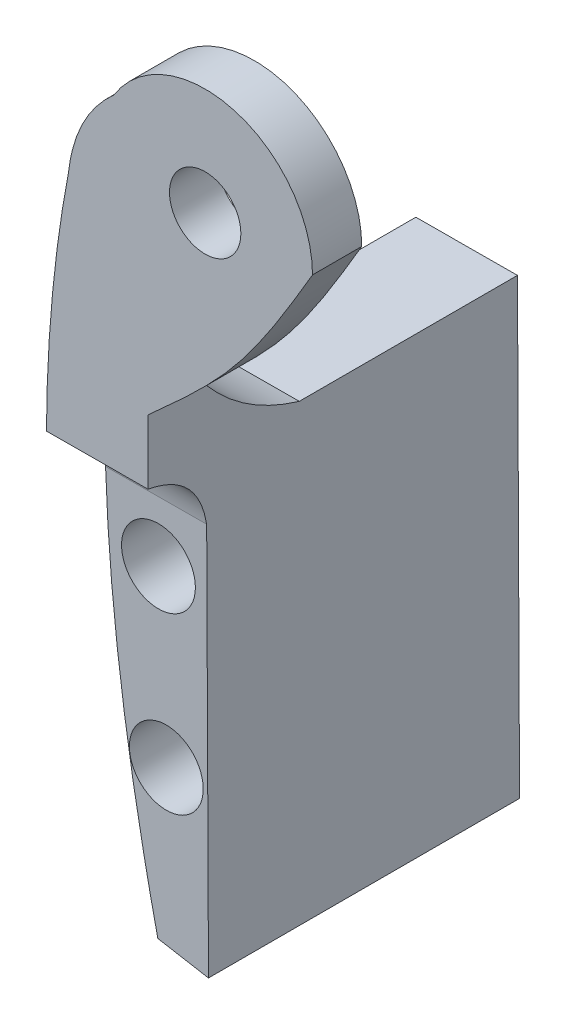
ISO-10303-21;
HEADER;
FILE_DESCRIPTION(('STEP AP214'),'2;1');
FILE_NAME('part.step','',(''),(''),'','','');
FILE_SCHEMA(('AUTOMOTIVE_DESIGN { 1 0 10303 214 1 1 1 1 }'));
ENDSEC;
DATA;
#1=APPLICATION_CONTEXT('core data for automotive mechanical design processes');
#2=APPLICATION_PROTOCOL_DEFINITION('international standard','automotive_design',2000,#1);
#3=PRODUCT_CONTEXT('',#1,'mechanical');
#4=PRODUCT('Part','Part','',(#3));
#5=PRODUCT_RELATED_PRODUCT_CATEGORY('part','',(#4));
#6=PRODUCT_DEFINITION_FORMATION('','',#4);
#7=PRODUCT_DEFINITION_CONTEXT('part definition',#1,'design');
#8=PRODUCT_DEFINITION('design','',#6,#7);
#9=PRODUCT_DEFINITION_SHAPE('','',#8);
#10=(LENGTH_UNIT() NAMED_UNIT(*) SI_UNIT(.MILLI.,.METRE.));
#11=(NAMED_UNIT(*) PLANE_ANGLE_UNIT() SI_UNIT($,.RADIAN.));
#12=(NAMED_UNIT(*) SI_UNIT($,.STERADIAN.) SOLID_ANGLE_UNIT());
#13=UNCERTAINTY_MEASURE_WITH_UNIT(LENGTH_MEASURE(1.E-05),#10,'distance_accuracy_value','');
#14=(GEOMETRIC_REPRESENTATION_CONTEXT(3) GLOBAL_UNCERTAINTY_ASSIGNED_CONTEXT((#13)) GLOBAL_UNIT_ASSIGNED_CONTEXT((#10,
#11,#12)) REPRESENTATION_CONTEXT('',''));
#15=CARTESIAN_POINT('',(0.,0.,0.));
#16=DIRECTION('',(0.,0.,1.));
#17=DIRECTION('',(1.,0.,0.));
#18=AXIS2_PLACEMENT_3D('',#15,#16,#17);
#19=CARTESIAN_POINT('',(-13.4668195684959,-57.3465360053866,-30.012932));
#20=DIRECTION('',(0.,0.,1.));
#21=DIRECTION('',(1.,0.,0.));
#22=AXIS2_PLACEMENT_3D('',#19,#20,#21);
#23=CYLINDRICAL_SURFACE('',#22,1.75);
#24=CARTESIAN_POINT('',(-13.4668195684959,-57.3465360053866,-30.012432));
#25=DIRECTION('',(0.,0.,1.));
#26=DIRECTION('',(1.,0.,0.));
#27=AXIS2_PLACEMENT_3D('',#24,#25,#26);
#28=CIRCLE('',#27,1.75);
#29=CARTESIAN_POINT('',(-11.7168195684959,-57.3465360053866,-30.012432));
#30=VERTEX_POINT('',#29);
#31=EDGE_CURVE('E298',#30,#30,#28,.T.);
#32=ORIENTED_EDGE('',*,*,#31,.F.);
#33=EDGE_LOOP('',(#32));
#34=FACE_BOUND('',#33,.T.);
#35=CARTESIAN_POINT('',(-13.4668195684959,-57.3465360053866,-14.7376635728735));
#36=DIRECTION('',(0.,0.,1.));
#37=DIRECTION('',(1.,0.,0.));
#38=AXIS2_PLACEMENT_3D('',#35,#36,#37);
#39=CIRCLE('',#38,1.75);
#40=CARTESIAN_POINT('',(-11.7168195684959,-57.3465360053866,-14.7376635728735));
#41=VERTEX_POINT('',#40);
#42=EDGE_CURVE('E42',#41,#41,#39,.F.);
#43=ORIENTED_EDGE('',*,*,#42,.F.);
#44=EDGE_LOOP('',(#43));
#45=FACE_BOUND('',#44,.T.);
#46=ADVANCED_FACE('F36',(#34,#45),#23,.F.);
#47=CARTESIAN_POINT('',(-14.1032089483154,-43.4968635205829,-30.012932));
#48=DIRECTION('',(0.,0.,1.));
#49=DIRECTION('',(1.,0.,0.));
#50=AXIS2_PLACEMENT_3D('',#47,#48,#49);
#51=CYLINDRICAL_SURFACE('',#50,1.75);
#52=CARTESIAN_POINT('',(-14.1032089483154,-43.4968635205829,-30.012432));
#53=DIRECTION('',(0.,0.,1.));
#54=DIRECTION('',(1.,0.,0.));
#55=AXIS2_PLACEMENT_3D('',#52,#53,#54);
#56=CIRCLE('',#55,1.75);
#57=CARTESIAN_POINT('',(-12.3532089483154,-43.4968635205829,-30.012432));
#58=VERTEX_POINT('',#57);
#59=EDGE_CURVE('E572',#58,#58,#56,.T.);
#60=ORIENTED_EDGE('',*,*,#59,.F.);
#61=EDGE_LOOP('',(#60));
#62=FACE_BOUND('',#61,.T.);
#63=CARTESIAN_POINT('',(-14.1032089483154,-43.4968635205829,-14.7376635728735));
#64=DIRECTION('',(0.,0.,1.));
#65=DIRECTION('',(1.,0.,0.));
#66=AXIS2_PLACEMENT_3D('',#63,#64,#65);
#67=CIRCLE('',#66,1.75);
#68=CARTESIAN_POINT('',(-12.3532089483154,-43.4968635205829,-14.7376635728735));
#69=VERTEX_POINT('',#68);
#70=EDGE_CURVE('E501',#69,#69,#67,.F.);
#71=ORIENTED_EDGE('',*,*,#70,.F.);
#72=EDGE_LOOP('',(#71));
#73=FACE_BOUND('',#72,.T.);
#74=ADVANCED_FACE('F310',(#62,#73),#51,.F.);
#75=CARTESIAN_POINT('',(-18.4013115985762,-30.5145625315887,-4.));
#76=CARTESIAN_POINT('',(-18.8489698571187,-43.6728294416428,-4.));
#77=CARTESIAN_POINT('',(-17.030220330295,-56.9393871702691,-4.));
#78=CARTESIAN_POINT('',(-14.1533851889596,-69.7168711338994,-4.));
#79=B_SPLINE_CURVE_WITH_KNOTS('',3,(#75,#76,#77,#78),.UNSPECIFIED.,.F.,.F.,(4,4),
(0.288118642181765,1.),.UNSPECIFIED.);
#80=DIRECTION('',(0.,0.,1.));
#81=VECTOR('',#80,1.);
#82=SURFACE_OF_LINEAR_EXTRUSION('',#79,#81);
#83=CARTESIAN_POINT('',(-18.46667392534,-33.8002319804328,0.));
#84=CARTESIAN_POINT('',(-18.4668174641096,-33.8243272538239,-0.132271913824663));
#85=CARTESIAN_POINT('',(-18.4669735466557,-33.8514398237352,-0.264031055509782));
#86=CARTESIAN_POINT('',(-18.4672979255476,-33.9123802015732,-0.526513562214173));
#87=CARTESIAN_POINT('',(-18.4674662663974,-33.9462333398355,-0.657231024717363));
#88=CARTESIAN_POINT('',(-18.4678011913545,-34.0212067140214,-0.916761470822965));
#89=CARTESIAN_POINT('',(-18.467967772988,-34.0623360293644,-1.04557185452524));
#90=CARTESIAN_POINT('',(-18.4682791719937,-34.1527613683063,-1.30148686556139));
#91=CARTESIAN_POINT('',(-18.4684238016443,-34.202120997477,-1.42856914722543));
#92=CARTESIAN_POINT('',(-18.468661075669,-34.3092222081255,-1.67899077422737));
#93=CARTESIAN_POINT('',(-18.4687537820458,-34.3669536883925,-1.80233441667947));
#94=CARTESIAN_POINT('',(-18.4688511543982,-34.4911926999776,-2.0444111032632));
#95=CARTESIAN_POINT('',(-18.4688558926446,-34.5576929819823,-2.16314785217213));
#96=CARTESIAN_POINT('',(-18.4687326190851,-34.7010447714343,-2.39725911606426));
#97=CARTESIAN_POINT('',(-18.4686021465596,-34.7780652080442,-2.51253060402271));
#98=CARTESIAN_POINT('',(-18.4681517594642,-34.9414577260494,-2.73626715796923));
#99=CARTESIAN_POINT('',(-18.4678318375132,-35.0278301716948,-2.8447319585846));
#100=CARTESIAN_POINT('',(-18.4669483803126,-35.2090804484661,-3.05323617500622));
#101=CARTESIAN_POINT('',(-18.4663862350884,-35.3039073366329,-3.15331983068522));
#102=CARTESIAN_POINT('',(-18.4649632017987,-35.5018564513623,-3.34490814043164));
#103=CARTESIAN_POINT('',(-18.4641023226171,-35.6049784311769,-3.43641304950956));
#104=CARTESIAN_POINT('',(-18.4620321827335,-35.8185234195223,-3.6101669840708));
#105=CARTESIAN_POINT('',(-18.4608233479218,-35.9289373762902,-3.69242715479757));
#106=CARTESIAN_POINT('',(-18.4580139943581,-36.1561657356226,-3.84755345763055));
#107=CARTESIAN_POINT('',(-18.4564134552446,-36.2729804706676,-3.92041910108905));
#108=CARTESIAN_POINT('',(-18.4527789635606,-36.5125079841816,-4.05710375277026));
#109=CARTESIAN_POINT('',(-18.4507429629668,-36.6352464334246,-4.12087755304617));
#110=CARTESIAN_POINT('',(-18.4462180860337,-36.8850894880771,-4.23925633134585));
#111=CARTESIAN_POINT('',(-18.443729063259,-37.0121954944524,-4.2938583336617));
#112=CARTESIAN_POINT('',(-18.4384732260774,-37.2608595774646,-4.39084824555274));
#113=CARTESIAN_POINT('',(-18.4357375887563,-37.3821922307929,-4.43382016176085));
#114=CARTESIAN_POINT('',(-18.4298567870328,-37.627126437991,-4.51266020502724));
#115=CARTESIAN_POINT('',(-18.4267116154767,-37.7507280314631,-4.54852820796422));
#116=CARTESIAN_POINT('',(-18.4200431529403,-37.9984243570623,-4.61334320090202));
#117=CARTESIAN_POINT('',(-18.4165238293419,-38.1225026517431,-4.64235400227019));
#118=CARTESIAN_POINT('',(-18.409086981246,-38.3718333983567,-4.69437671225895));
#119=CARTESIAN_POINT('',(-18.4051696725881,-38.4970851807633,-4.71739184862867));
#120=CARTESIAN_POINT('',(-18.4010537266685,-38.6227438181572,-4.73766357287346));
#121=B_SPLINE_CURVE_WITH_KNOTS('',3,(#83,#84,#85,#86,#87,#88,#89,#90,#91,#92,#93,#94,#95,#96,
#97,#98,#99,#100,#101,#102,#103,#104,#105,#106,#107,#108,#109,#110,#111,#112,#113,#114,#115,
#116,#117,#118,#119,#120),.UNSPECIFIED.,.F.,.F.,(4,2,2,2,2,2,2,2,2,2,2,2,2,2,2,2,2,2,4),(0.,
0.403365698881645,0.808276826765033,1.21369682461068,1.62240903489821,2.03063214692734,
2.43851986563049,2.85396339337614,3.26942310799237,3.68252976609317,4.09562414035324,
4.50821503058706,4.92082737270704,5.33542471055283,5.75015630207621,6.13616523206208,
6.52218090589579,6.9044489806133,7.28651083513125),.UNSPECIFIED.);
#122=CARTESIAN_POINT('',(-18.4666739253338,-33.8002319804328,0.));
#123=VERTEX_POINT('',#122);
#124=CARTESIAN_POINT('',(-18.4541996092962,-36.4187000525996,-4.00347361352709));
#125=VERTEX_POINT('',#124);
#126=EDGE_CURVE('E546',#123,#125,#121,.T.);
#127=ORIENTED_EDGE('',*,*,#126,.F.);
#128=CARTESIAN_POINT('',(-18.4013115985762,-30.5145625315887,0.));
#129=CARTESIAN_POINT('',(-18.8489698571187,-43.6728294416428,0.));
#130=CARTESIAN_POINT('',(-17.030220330295,-56.9393871702691,0.));
#131=CARTESIAN_POINT('',(-14.1533851889596,-69.7168711338994,0.));
#132=B_SPLINE_CURVE_WITH_KNOTS('',3,(#128,#129,#130,#131),.UNSPECIFIED.,.F.,.F.,(4,4),
(0.288118642181765,1.),.UNSPECIFIED.);
#133=CARTESIAN_POINT('',(-18.4013115985762,-30.5145625315887,0.));
#134=VERTEX_POINT('',#133);
#135=EDGE_CURVE('E176',#134,#123,#132,.T.);
#136=ORIENTED_EDGE('',*,*,#135,.F.);
#137=DIRECTION('',(0.,0.,1.));
#138=VECTOR('',#137,1.);
#139=CARTESIAN_POINT('',(-18.4013115985762,-30.5145625315887,-4.));
#140=LINE('',#139,#138);
#141=CARTESIAN_POINT('',(-18.4013115985762,-30.5145625315887,-3.65656254918377));
#142=VERTEX_POINT('',#141);
#143=EDGE_CURVE('E287',#142,#134,#140,.T.);
#144=ORIENTED_EDGE('',*,*,#143,.F.);
#145=CARTESIAN_POINT('',(-18.4321154308833,-37.5329231503396,-2.72902522077541));
#146=CARTESIAN_POINT('',(-18.4392020404507,-37.2404809830243,-2.76767905765274));
#147=CARTESIAN_POINT('',(-18.4452788054023,-36.9480144799296,-2.80633549983433));
#148=CARTESIAN_POINT('',(-18.4553843804912,-36.3630913029361,-2.88364584616737));
#149=CARTESIAN_POINT('',(-18.4594135036139,-36.0706346343716,-2.92229974980319));
#150=CARTESIAN_POINT('',(-18.4653974007291,-35.4857307418935,-2.9996050538984));
#151=CARTESIAN_POINT('',(-18.4673523913601,-35.1932835201844,-3.0382564541975));
#152=CARTESIAN_POINT('',(-18.4691612415985,-34.6083982830459,-3.11555676691997));
#153=CARTESIAN_POINT('',(-18.4690152148241,-34.3159602679739,-3.15420567936485));
#154=CARTESIAN_POINT('',(-18.4665948467472,-33.7310911822529,-3.23150129886318));
#155=CARTESIAN_POINT('',(-18.464320494707,-33.4386601116464,-3.27014800590452));
#156=CARTESIAN_POINT('',(-18.4576158832542,-32.8538073969909,-3.34743886986016));
#157=CARTESIAN_POINT('',(-18.4531855159564,-32.5613857541461,-3.38608302655005));
#158=CARTESIAN_POINT('',(-18.4421408968436,-31.9765523757488,-3.46336870934236));
#159=CARTESIAN_POINT('',(-18.4355264183986,-31.6841406443751,-3.50201023475541));
#160=CARTESIAN_POINT('',(-18.4200852226909,-31.0993277406662,-3.57929055170435));
#161=CARTESIAN_POINT('',(-18.4112581524209,-30.8069265774693,-3.61792934181894));
#162=CARTESIAN_POINT('',(-18.4013115985762,-30.5145625315887,-3.65656254918377));
#163=B_SPLINE_CURVE_WITH_KNOTS('',3,(#145,#146,#147,#148,#149,#150,#151,#152,#153,#154,#155,
#156,#157,#158,#159,#160,#161,#162),.UNSPECIFIED.,.F.,.F.,(4,2,2,2,2,2,2,2,4),(0.,
0.885210891256764,1.77028643585538,2.65526952716191,3.54020476078363,4.42514445906533,
5.3101284435679,6.19520428563712,7.08042142688973),.UNSPECIFIED.);
#164=CARTESIAN_POINT('',(-18.4663936069757,-33.7548916970278,-3.22835566912074));
#165=VERTEX_POINT('',#164);
#166=EDGE_CURVE('E463',#165,#142,#163,.T.);
#167=ORIENTED_EDGE('',*,*,#166,.F.);
#168=DIRECTION('',(0.,0.,1.));
#169=VECTOR('',#168,1.);
#170=CARTESIAN_POINT('',(-18.4663936069757,-33.7548916970278,-4.));
#171=LINE('',#170,#169);
#172=CARTESIAN_POINT('',(-18.4663936429212,-33.7548838446581,-4.));
#173=VERTEX_POINT('',#172);
#174=EDGE_CURVE('E417',#173,#165,#171,.T.);
#175=ORIENTED_EDGE('',*,*,#174,.F.);
#176=CARTESIAN_POINT('',(-18.4663936069196,-33.7548916882165,-4.));
#177=DIRECTION('',(0.,0.,-1.));
#178=VECTOR('',#177,1.);
#179=LINE('',#176,#178);
#180=CARTESIAN_POINT('',(-18.4663936069757,-33.7548916970278,-12.284940373622));
#181=VERTEX_POINT('',#180);
#182=EDGE_CURVE('E414',#173,#181,#179,.T.);
#183=ORIENTED_EDGE('',*,*,#182,.T.);
#184=DIRECTION('',(0.,0.,1.));
#185=VECTOR('',#184,1.);
#186=CARTESIAN_POINT('',(-18.4663935069097,-33.7548759915013,-17.006216));
#187=LINE('',#186,#185);
#188=CARTESIAN_POINT('',(-18.4663935069097,-33.7548759915013,-30.012432));
#189=VERTEX_POINT('',#188);
#190=EDGE_CURVE('E380',#189,#181,#187,.T.);
#191=ORIENTED_EDGE('',*,*,#190,.F.);
#192=CARTESIAN_POINT('',(-18.4663935069097,-33.7548759915013,-30.012432));
#193=CARTESIAN_POINT('',(-18.5434333171569,-45.8462770612342,-30.012432));
#194=CARTESIAN_POINT('',(-16.7942088460879,-57.9876338742109,-30.012432));
#195=CARTESIAN_POINT('',(-14.1533851889596,-69.7168711338994,-30.012432));
#196=B_SPLINE_CURVE_WITH_KNOTS('',3,(#192,#193,#194,#195),.UNSPECIFIED.,.F.,.F.,(4,4),
(0.346520381448641,1.),.UNSPECIFIED.);
#197=CARTESIAN_POINT('',(-14.1533851889596,-69.7168711338994,-30.012432));
#198=VERTEX_POINT('',#197);
#199=EDGE_CURVE('E294',#198,#189,#196,.F.);
#200=ORIENTED_EDGE('',*,*,#199,.F.);
#201=DIRECTION('',(0.,0.,1.));
#202=VECTOR('',#201,1.);
#203=CARTESIAN_POINT('',(-14.1533851889596,-69.7168711338994,-4.));
#204=LINE('',#203,#202);
#205=CARTESIAN_POINT('',(-14.1533851889596,-69.7168711338995,-4.73766357287346));
#206=VERTEX_POINT('',#205);
#207=EDGE_CURVE('E209',#198,#206,#204,.T.);
#208=ORIENTED_EDGE('',*,*,#207,.T.);
#209=CARTESIAN_POINT('',(-18.4013115985762,-30.5145625315887,-4.73766357287346));
#210=CARTESIAN_POINT('',(-18.8489698571187,-43.6728294416428,-4.73766357287346));
#211=CARTESIAN_POINT('',(-17.030220330295,-56.9393871702691,-4.73766357287346));
#212=CARTESIAN_POINT('',(-14.1533851889596,-69.7168711338994,-4.73766357287346));
#213=B_SPLINE_CURVE_WITH_KNOTS('',3,(#209,#210,#211,#212),.UNSPECIFIED.,.F.,.F.,(4,4),
(0.288118642181765,1.),.UNSPECIFIED.);
#214=CARTESIAN_POINT('',(-18.4010537266652,-38.6227438181572,-4.73766357287346));
#215=VERTEX_POINT('',#214);
#216=EDGE_CURVE('E448',#215,#206,#213,.T.);
#217=ORIENTED_EDGE('',*,*,#216,.F.);
#218=CARTESIAN_POINT('',(-18.4460669376235,-36.8897435764286,-4.23948741376031));
#219=VERTEX_POINT('',#218);
#220=EDGE_CURVE('E539',#219,#215,#121,.T.);
#221=ORIENTED_EDGE('',*,*,#220,.F.);
#222=CARTESIAN_POINT('',(-18.4662162172912,-33.7275389071541,-12.3551358814129));
#223=CARTESIAN_POINT('',(-18.4675985030254,-33.9370043141445,-11.8175847572993));
#224=CARTESIAN_POINT('',(-18.4684324238947,-34.1464680112044,-11.2800315793265));
#225=CARTESIAN_POINT('',(-18.4690136862555,-34.5653898440573,-10.2049267305644));
#226=CARTESIAN_POINT('',(-18.4687610352316,-34.7748479798787,-9.6673750597902));
#227=CARTESIAN_POINT('',(-18.4671793255896,-35.1937587278615,-8.59227324841029));
#228=CARTESIAN_POINT('',(-18.4658502706035,-35.4032113400391,-8.0547231078055));
#229=CARTESIAN_POINT('',(-18.4621257912463,-35.8221110569892,-6.97962443297702));
#230=CARTESIAN_POINT('',(-18.4597303669661,-36.0315581617621,-6.44207589875319));
#231=CARTESIAN_POINT('',(-18.4538830949565,-36.4504469505588,-5.36698033113895));
#232=CARTESIAN_POINT('',(-18.4504312435723,-36.6598886345615,-4.82943329776017));
#233=CARTESIAN_POINT('',(-18.4424809353723,-37.0787666463606,-3.75434068153661));
#234=CARTESIAN_POINT('',(-18.4379824714589,-37.2882029741111,-3.2167950987264));
#235=CARTESIAN_POINT('',(-18.4329656323965,-37.4976355979475,-2.67925293169094));
#236=B_SPLINE_CURVE_WITH_KNOTS('',3,(#222,#223,#224,#225,#226,#227,#228,#229,#230,#231,#232,
#233,#234,#235),.UNSPECIFIED.,.F.,.F.,(4,2,2,2,2,2,4),(0.,1.73076540801384,3.46151889397486,
5.19226654012972,6.92301403854987,8.65376752450908,10.3845327478417),.UNSPECIFIED.);
#237=CARTESIAN_POINT('',(-18.4541996093408,-36.4187000428519,-5.44845860761911));
#238=VERTEX_POINT('',#237);
#239=EDGE_CURVE('E420',#238,#219,#236,.T.);
#240=ORIENTED_EDGE('',*,*,#239,.F.);
#241=DIRECTION('',(0.,0.,1.));
#242=VECTOR('',#241,1.);
#243=CARTESIAN_POINT('',(-18.4541996093408,-36.4187000428519,-4.));
#244=LINE('',#243,#242);
#245=EDGE_CURVE('E421',#125,#238,#244,.F.);
#246=ORIENTED_EDGE('',*,*,#245,.F.);
#247=EDGE_LOOP('',(#127,#136,#144,#167,#175,#183,#191,#200,#208,#217,#221,#240,#246));
#248=FACE_BOUND('',#247,.T.);
#249=ADVANCED_FACE('F300',(#248),#82,.T.);
#250=CARTESIAN_POINT('',(-16.6639162338456,-14.6308064254302,-4.));
#251=CARTESIAN_POINT('',(-17.667702323107,-19.8812510451323,-4.));
#252=CARTESIAN_POINT('',(-18.2201315631726,-25.1890374929657,-4.));
#253=CARTESIAN_POINT('',(-18.4013115985762,-30.5145625315888,-4.));
#254=B_SPLINE_CURVE_WITH_KNOTS('',3,(#250,#251,#252,#253),.UNSPECIFIED.,.F.,.F.,(4,4),(0.,
0.288118642181765),.UNSPECIFIED.);
#255=DIRECTION('',(0.,0.,1.));
#256=VECTOR('',#255,1.);
#257=SURFACE_OF_LINEAR_EXTRUSION('',#254,#256);
#258=CARTESIAN_POINT('',(-18.4013115985762,-30.5145625315888,-3.65656254918375));
#259=CARTESIAN_POINT('',(-18.3865961658575,-30.0811447890571,-3.71383471740035));
#260=CARTESIAN_POINT('',(-18.3693768831801,-29.6478388923828,-3.77109058911621));
#261=CARTESIAN_POINT('',(-18.329930617908,-28.781450790749,-3.88556973954646));
#262=CARTESIAN_POINT('',(-18.3077036353132,-28.3483685857896,-3.94279301826085));
#263=CARTESIAN_POINT('',(-18.2829728027598,-27.9153982266877,-4.00000000047451));
#264=B_SPLINE_CURVE_WITH_KNOTS('',3,(#258,#259,#260,#261,#262,#263),.UNSPECIFIED.,.F.,.F.,(4,2,
4),(0.,1.31223421983706,2.62446843967412),.UNSPECIFIED.);
#265=CARTESIAN_POINT('',(-18.2829631133035,-27.915398185923,-4.));
#266=VERTEX_POINT('',#265);
#267=EDGE_CURVE('E470',#142,#266,#264,.T.);
#268=ORIENTED_EDGE('',*,*,#267,.F.);
#269=ORIENTED_EDGE('',*,*,#143,.T.);
#270=CARTESIAN_POINT('',(-18.4013115985762,-30.5145625315888,0.));
#271=CARTESIAN_POINT('',(-18.2201315631726,-25.1890374929657,0.));
#272=CARTESIAN_POINT('',(-17.667702323107,-19.8812510451323,0.));
#273=CARTESIAN_POINT('',(-16.6639162338456,-14.6308064254302,0.));
#274=B_SPLINE_CURVE_WITH_KNOTS('',3,(#270,#271,#272,#273),.UNSPECIFIED.,.F.,.F.,(4,4),(0.,
0.288118642181765),.UNSPECIFIED.);
#275=CARTESIAN_POINT('',(-16.6639162338456,-14.6308064254302,0.));
#276=VERTEX_POINT('',#275);
#277=EDGE_CURVE('E186',#276,#134,#274,.F.);
#278=ORIENTED_EDGE('',*,*,#277,.F.);
#279=DIRECTION('',(0.,0.,1.));
#280=VECTOR('',#279,1.);
#281=CARTESIAN_POINT('',(-16.6639162338456,-14.6308064254302,-4.));
#282=LINE('',#281,#280);
#283=CARTESIAN_POINT('',(-16.6639162338456,-14.6308064254302,-4.));
#284=VERTEX_POINT('',#283);
#285=EDGE_CURVE('E47',#284,#276,#282,.T.);
#286=ORIENTED_EDGE('',*,*,#285,.F.);
#287=CARTESIAN_POINT('',(-16.6639162338456,-14.6308064254302,-4.));
#288=CARTESIAN_POINT('',(-17.5043010603132,-19.0265577093046,-4.));
#289=CARTESIAN_POINT('',(-18.0283167596165,-23.4625015462515,-4.));
#290=CARTESIAN_POINT('',(-18.2829727688494,-27.9153976337335,-4.));
#291=B_SPLINE_CURVE_WITH_KNOTS('',3,(#287,#288,#289,#290),.UNSPECIFIED.,.F.,.F.,(4,4),(0.,
0.241217265015266),.UNSPECIFIED.);
#292=EDGE_CURVE('E212',#284,#266,#291,.T.);
#293=ORIENTED_EDGE('',*,*,#292,.T.);
#294=EDGE_LOOP('',(#268,#269,#278,#286,#293));
#295=FACE_BOUND('',#294,.T.);
#296=ADVANCED_FACE('F38',(#295),#257,.T.);
#297=CARTESIAN_POINT('',(-12.9861837221063,-7.40648895480318,-4.));
#298=CARTESIAN_POINT('',(-16.1577958352121,-10.2367637695111,-4.));
#299=CARTESIAN_POINT('',(-16.6639162338456,-14.6308064254302,-4.));
#300=B_SPLINE_CURVE_WITH_KNOTS('',2,(#297,#298,#299),.UNSPECIFIED.,.F.,.F.,(3,3),(0.,1.),.UNSPECIFIED.);
#301=DIRECTION('',(0.,0.,1.));
#302=VECTOR('',#301,1.);
#303=SURFACE_OF_LINEAR_EXTRUSION('',#300,#302);
#304=CARTESIAN_POINT('',(-12.9861837221063,-7.40648895480318,0.));
#305=CARTESIAN_POINT('',(-16.1577958352121,-10.2367637695111,0.));
#306=CARTESIAN_POINT('',(-16.6639162338456,-14.6308064254302,0.));
#307=B_SPLINE_CURVE_WITH_KNOTS('',2,(#304,#305,#306),.UNSPECIFIED.,.F.,.F.,(3,3),(0.,1.),.UNSPECIFIED.);
#308=CARTESIAN_POINT('',(-12.9861837221063,-7.40648895480318,0.));
#309=VERTEX_POINT('',#308);
#310=EDGE_CURVE('E201',#309,#276,#307,.T.);
#311=ORIENTED_EDGE('',*,*,#310,.F.);
#312=DIRECTION('',(0.,0.,1.));
#313=VECTOR('',#312,1.);
#314=CARTESIAN_POINT('',(-12.9861837221063,-7.40648895480318,-4.));
#315=LINE('',#314,#313);
#316=CARTESIAN_POINT('',(-12.9861837221063,-7.40648895480318,-4.));
#317=VERTEX_POINT('',#316);
#318=EDGE_CURVE('E202',#317,#309,#315,.T.);
#319=ORIENTED_EDGE('',*,*,#318,.F.);
#320=EDGE_CURVE('E591',#317,#284,#300,.T.);
#321=ORIENTED_EDGE('',*,*,#320,.T.);
#322=ORIENTED_EDGE('',*,*,#285,.T.);
#323=EDGE_LOOP('',(#311,#319,#321,#322));
#324=FACE_BOUND('',#323,.T.);
#325=ADVANCED_FACE('F247',(#324),#303,.T.);
#326=CARTESIAN_POINT('',(-5.57162803204002,-11.9999999999996,-4.));
#327=DIRECTION('',(0.,0.,1.));
#328=DIRECTION('',(1.,0.,0.));
#329=AXIS2_PLACEMENT_3D('',#326,#327,#328);
#330=CYLINDRICAL_SURFACE('',#329,8.722154539071);
#331=CARTESIAN_POINT('',(-5.57162803204002,-11.9999999999996,0.));
#332=DIRECTION('',(0.,0.,1.));
#333=DIRECTION('',(1.,0.,0.));
#334=AXIS2_PLACEMENT_3D('',#331,#332,#333);
#335=CIRCLE('',#334,8.722154539071);
#336=CARTESIAN_POINT('',(3.15052650703097,-11.9999999999996,0.));
#337=VERTEX_POINT('',#336);
#338=EDGE_CURVE('E184',#337,#309,#335,.T.);
#339=ORIENTED_EDGE('',*,*,#338,.F.);
#340=DIRECTION('',(0.,0.,1.));
#341=VECTOR('',#340,1.);
#342=CARTESIAN_POINT('',(3.15052650703097,-11.9999999999996,-4.));
#343=LINE('',#342,#341);
#344=CARTESIAN_POINT('',(3.15052650703097,-11.9999999999996,-4.));
#345=VERTEX_POINT('',#344);
#346=EDGE_CURVE('E89',#345,#337,#343,.T.);
#347=ORIENTED_EDGE('',*,*,#346,.F.);
#348=CARTESIAN_POINT('',(-5.57162803204002,-11.9999999999996,-4.));
#349=DIRECTION('',(0.,0.,1.));
#350=DIRECTION('',(1.,0.,0.));
#351=AXIS2_PLACEMENT_3D('',#348,#349,#350);
#352=CIRCLE('',#351,8.722154539071);
#353=EDGE_CURVE('E330',#345,#317,#352,.T.);
#354=ORIENTED_EDGE('',*,*,#353,.T.);
#355=ORIENTED_EDGE('',*,*,#318,.T.);
#356=EDGE_LOOP('',(#339,#347,#354,#355));
#357=FACE_BOUND('',#356,.T.);
#358=ADVANCED_FACE('F337',(#357),#330,.T.);
#359=CARTESIAN_POINT('',(-10.2316008179203,-28.548135162408,-4.));
#360=CARTESIAN_POINT('',(-7.86437332426008,-26.4272964203006,-4.));
#361=CARTESIAN_POINT('',(-2.52235469825568,-21.6412925007652,-4.));
#362=CARTESIAN_POINT('',(1.12142674466251,-15.4485376326927,-4.));
#363=CARTESIAN_POINT('',(3.15052650703097,-11.9999999999996,-4.));
#364=B_SPLINE_CURVE_WITH_KNOTS('',3,(#359,#360,#361,#362,#363),.UNSPECIFIED.,.F.,.F.,(4,1,4),
(0.,0.443133515509802,1.),.UNSPECIFIED.);
#365=DIRECTION('',(0.,0.,1.));
#366=VECTOR('',#365,1.);
#367=SURFACE_OF_LINEAR_EXTRUSION('',#364,#366);
#368=CARTESIAN_POINT('',(-10.2316008179203,-28.548135162408,0.));
#369=CARTESIAN_POINT('',(-7.86437332426008,-26.4272964203006,0.));
#370=CARTESIAN_POINT('',(-2.52235469825568,-21.6412925007652,0.));
#371=CARTESIAN_POINT('',(1.12142674466251,-15.4485376326927,0.));
#372=CARTESIAN_POINT('',(3.15052650703097,-11.9999999999996,0.));
#373=B_SPLINE_CURVE_WITH_KNOTS('',3,(#368,#369,#370,#371,#372),.UNSPECIFIED.,.F.,.F.,(4,1,4),
(0.,0.443133515509802,1.),.UNSPECIFIED.);
#374=CARTESIAN_POINT('',(-10.2316008179203,-28.548135162408,0.));
#375=VERTEX_POINT('',#374);
#376=EDGE_CURVE('E182',#375,#337,#373,.T.);
#377=ORIENTED_EDGE('',*,*,#376,.F.);
#378=DIRECTION('',(0.,0.,1.));
#379=VECTOR('',#378,1.);
#380=CARTESIAN_POINT('',(-10.2316008179203,-28.548135162408,-4.));
#381=LINE('',#380,#379);
#382=CARTESIAN_POINT('',(-10.2316008179203,-28.548135162408,-4.));
#383=VERTEX_POINT('',#382);
#384=EDGE_CURVE('E180',#383,#375,#381,.T.);
#385=ORIENTED_EDGE('',*,*,#384,.F.);
#386=EDGE_CURVE('E322',#383,#345,#364,.T.);
#387=ORIENTED_EDGE('',*,*,#386,.T.);
#388=ORIENTED_EDGE('',*,*,#346,.T.);
#389=EDGE_LOOP('',(#377,#385,#387,#388));
#390=FACE_BOUND('',#389,.T.);
#391=ADVANCED_FACE('F335',(#390),#367,.T.);
#392=CARTESIAN_POINT('',(-10.0398414787974,-70.4384276849433,-4.));
#393=DIRECTION('',(0.999989522698505,0.00457760780494255,0.));
#394=DIRECTION('',(-0.00457760780494255,0.999989522698505,0.));
#395=AXIS2_PLACEMENT_3D('',#392,#393,#394);
#396=PLANE('',#395);
#397=CARTESIAN_POINT('',(-10.1856548806396,-38.5851365502562,-4.73766357287346));
#398=CARTESIAN_POINT('',(-10.2043305542793,-34.5053903673414,-4.07974368294089));
#399=CARTESIAN_POINT('',(-10.207731592213,-33.762425385437,0.));
#400=B_SPLINE_CURVE_WITH_KNOTS('',2,(#397,#398,#399),.UNSPECIFIED.,.F.,.F.,(3,3),(0.,1.),.UNSPECIFIED.);
#401=CARTESIAN_POINT('',(-10.1856548806396,-38.5851365502562,-4.73766357287346));
#402=VERTEX_POINT('',#401);
#403=CARTESIAN_POINT('',(-10.207731592213,-33.762425385437,0.));
#404=VERTEX_POINT('',#403);
#405=EDGE_CURVE('E155',#402,#404,#400,.T.);
#406=ORIENTED_EDGE('',*,*,#405,.F.);
#407=DIRECTION('',(-0.00457760780494255,0.999989522698505,0.));
#408=VECTOR('',#407,1.);
#409=CARTESIAN_POINT('',(-10.1856548806396,-38.5851365502562,-4.73766357287346));
#410=LINE('',#409,#408);
#411=CARTESIAN_POINT('',(-10.0398414787974,-70.4384276849433,-4.73766357287346));
#412=VERTEX_POINT('',#411);
#413=EDGE_CURVE('E166',#412,#402,#410,.T.);
#414=ORIENTED_EDGE('',*,*,#413,.F.);
#415=DIRECTION('',(0.,0.,1.));
#416=VECTOR('',#415,1.);
#417=CARTESIAN_POINT('',(-10.0398414787974,-70.4384276849433,-4.));
#418=LINE('',#417,#416);
#419=CARTESIAN_POINT('',(-10.0398414787974,-70.4384276849433,-30.012432));
#420=VERTEX_POINT('',#419);
#421=EDGE_CURVE('E206',#420,#412,#418,.T.);
#422=ORIENTED_EDGE('',*,*,#421,.F.);
#423=DIRECTION('',(0.00457760780494154,-0.999989522698505,0.));
#424=VECTOR('',#423,1.);
#425=CARTESIAN_POINT('',(-10.2079392060906,-33.7170716305494,-30.012432));
#426=LINE('',#425,#424);
#427=CARTESIAN_POINT('',(-10.2079392060906,-33.7170716305494,-30.012432));
#428=VERTEX_POINT('',#427);
#429=EDGE_CURVE('E377',#428,#420,#426,.T.);
#430=ORIENTED_EDGE('',*,*,#429,.F.);
#431=DIRECTION('',(0.,0.,1.));
#432=VECTOR('',#431,1.);
#433=CARTESIAN_POINT('',(-10.2079392060906,-33.7170716305494,-30.012432));
#434=LINE('',#433,#432);
#435=CARTESIAN_POINT('',(-10.2079392060906,-33.7170716305494,-12.2849806787605));
#436=VERTEX_POINT('',#435);
#437=EDGE_CURVE('E384',#428,#436,#434,.T.);
#438=ORIENTED_EDGE('',*,*,#437,.T.);
#439=CARTESIAN_POINT('',(-10.2079392060906,-33.7170716305494,-12.2849806787605));
#440=CARTESIAN_POINT('',(-10.2148806816074,-32.2006894753647,-7.15767138161684));
#441=CARTESIAN_POINT('',(-10.2346659215122,-27.8785558518732,-4.));
#442=B_SPLINE_CURVE_WITH_KNOTS('',2,(#439,#440,#441),.UNSPECIFIED.,.F.,.F.,(3,3),(0.,1.),.UNSPECIFIED.);
#443=CARTESIAN_POINT('',(-10.2346659215122,-27.8785558518732,-4.));
#444=VERTEX_POINT('',#443);
#445=EDGE_CURVE('E442',#436,#444,#442,.T.);
#446=ORIENTED_EDGE('',*,*,#445,.T.);
#447=DIRECTION('',(-0.00457760780494303,0.999989522698505,0.));
#448=VECTOR('',#447,1.);
#449=CARTESIAN_POINT('',(-10.2592421359513,-22.5098222263881,-4.));
#450=LINE('',#449,#448);
#451=EDGE_CURVE('E454',#383,#444,#450,.T.);
#452=ORIENTED_EDGE('',*,*,#451,.F.);
#453=ORIENTED_EDGE('',*,*,#384,.T.);
#454=DIRECTION('',(-0.00457760780494255,0.999989522698505,0.));
#455=VECTOR('',#454,1.);
#456=CARTESIAN_POINT('',(-10.0398414787974,-70.4384276849433,0.));
#457=LINE('',#456,#455);
#458=EDGE_CURVE('E172',#404,#375,#457,.T.);
#459=ORIENTED_EDGE('',*,*,#458,.F.);
#460=EDGE_LOOP('',(#406,#414,#422,#430,#438,#446,#452,#453,#459));
#461=FACE_BOUND('',#460,.T.);
#462=ADVANCED_FACE('F178',(#461),#396,.T.);
#463=CARTESIAN_POINT('',(-14.1533851889596,-69.7168711338995,-4.));
#464=DIRECTION('',(-0.172772117417386,-0.98496182435824,0.));
#465=DIRECTION('',(0.98496182435824,-0.172772117417386,0.));
#466=AXIS2_PLACEMENT_3D('',#463,#464,#465);
#467=PLANE('',#466);
#468=DIRECTION('',(0.98496182435824,-0.172772117417386,0.));
#469=VECTOR('',#468,1.);
#470=CARTESIAN_POINT('',(-14.1533851889596,-69.7168711338995,-4.73766357287346));
#471=LINE('',#470,#469);
#472=EDGE_CURVE('E549',#206,#412,#471,.T.);
#473=ORIENTED_EDGE('',*,*,#472,.F.);
#474=ORIENTED_EDGE('',*,*,#207,.F.);
#475=DIRECTION('',(-0.984961824358234,0.172772117417422,0.));
#476=VECTOR('',#475,1.);
#477=CARTESIAN_POINT('',(-10.0398414787974,-70.4384276849433,-30.012432));
#478=LINE('',#477,#476);
#479=EDGE_CURVE('E369',#420,#198,#478,.T.);
#480=ORIENTED_EDGE('',*,*,#479,.F.);
#481=ORIENTED_EDGE('',*,*,#421,.T.);
#482=EDGE_LOOP('',(#473,#474,#480,#481));
#483=FACE_BOUND('',#482,.T.);
#484=ADVANCED_FACE('F240',(#483),#467,.T.);
#485=CARTESIAN_POINT('',(-17.8410911864076,-22.5445293214141,-4.));
#486=DIRECTION('',(0.,0.,-1.));
#487=DIRECTION('',(-1.,0.,0.));
#488=AXIS2_PLACEMENT_3D('',#485,#486,#487);
#489=PLANE('',#488);
#490=DIRECTION('',(0.999989522698505,0.00457760780494255,0.));
#491=VECTOR('',#490,1.);
#492=CARTESIAN_POINT('',(-18.4931203942882,-27.9163602136122,-4.));
#493=LINE('',#492,#491);
#494=EDGE_CURVE('E435',#266,#444,#493,.T.);
#495=ORIENTED_EDGE('',*,*,#494,.F.);
#496=ORIENTED_EDGE('',*,*,#292,.F.);
#497=ORIENTED_EDGE('',*,*,#320,.F.);
#498=ORIENTED_EDGE('',*,*,#353,.F.);
#499=ORIENTED_EDGE('',*,*,#386,.F.);
#500=ORIENTED_EDGE('',*,*,#451,.T.);
#501=EDGE_LOOP('',(#495,#496,#497,#498,#499,#500));
#502=FACE_BOUND('',#501,.T.);
#503=CARTESIAN_POINT('',(-5.57162803204002,-11.9999999999996,-4.));
#504=DIRECTION('',(0.,0.,1.));
#505=DIRECTION('',(1.,0.,0.));
#506=AXIS2_PLACEMENT_3D('',#503,#504,#505);
#507=CIRCLE('',#506,2.9);
#508=CARTESIAN_POINT('',(-2.67162803204002,-11.9999999999996,-4.));
#509=VERTEX_POINT('',#508);
#510=EDGE_CURVE('E391',#509,#509,#507,.T.);
#511=ORIENTED_EDGE('',*,*,#510,.T.);
#512=EDGE_LOOP('',(#511));
#513=FACE_BOUND('',#512,.T.);
#514=ADVANCED_FACE('F230',(#502,#513),#489,.T.);
#515=CARTESIAN_POINT('',(-17.8410911864076,-22.5445293214141,0.));
#516=DIRECTION('',(0.,0.,-1.));
#517=DIRECTION('',(-1.,0.,0.));
#518=AXIS2_PLACEMENT_3D('',#515,#516,#517);
#519=PLANE('',#518);
#520=CARTESIAN_POINT('',(-5.57162803204002,-11.9999999999996,0.));
#521=DIRECTION('',(0.,0.,1.));
#522=DIRECTION('',(1.,0.,0.));
#523=AXIS2_PLACEMENT_3D('',#520,#521,#522);
#524=CIRCLE('',#523,2.9);
#525=CARTESIAN_POINT('',(-2.67162803204002,-11.9999999999996,0.));
#526=VERTEX_POINT('',#525);
#527=EDGE_CURVE('E383',#526,#526,#524,.T.);
#528=ORIENTED_EDGE('',*,*,#527,.F.);
#529=EDGE_LOOP('',(#528));
#530=FACE_BOUND('',#529,.T.);
#531=ORIENTED_EDGE('',*,*,#135,.T.);
#532=DIRECTION('',(0.999989522698505,0.00457760780494255,0.));
#533=VECTOR('',#532,1.);
#534=CARTESIAN_POINT('',(-18.7928760545833,-33.8017252214908,0.));
#535=LINE('',#534,#533);
#536=EDGE_CURVE('E158',#123,#404,#535,.T.);
#537=ORIENTED_EDGE('',*,*,#536,.T.);
#538=ORIENTED_EDGE('',*,*,#458,.T.);
#539=ORIENTED_EDGE('',*,*,#376,.T.);
#540=ORIENTED_EDGE('',*,*,#338,.T.);
#541=ORIENTED_EDGE('',*,*,#310,.T.);
#542=ORIENTED_EDGE('',*,*,#277,.T.);
#543=EDGE_LOOP('',(#531,#537,#538,#539,#540,#541,#542));
#544=FACE_BOUND('',#543,.T.);
#545=ADVANCED_FACE('F170',(#530,#544),#519,.F.);
#546=CARTESIAN_POINT('',(-5.57162803204002,-11.9999999999996,-4.));
#547=DIRECTION('',(0.,0.,1.));
#548=DIRECTION('',(1.,0.,0.));
#549=AXIS2_PLACEMENT_3D('',#546,#547,#548);
#550=CYLINDRICAL_SURFACE('',#549,2.9);
#551=ORIENTED_EDGE('',*,*,#510,.F.);
#552=EDGE_LOOP('',(#551));
#553=FACE_BOUND('',#552,.T.);
#554=ORIENTED_EDGE('',*,*,#527,.T.);
#555=EDGE_LOOP('',(#554));
#556=FACE_BOUND('',#555,.T.);
#557=ADVANCED_FACE('F241',(#553,#556),#550,.F.);
#558=CARTESIAN_POINT('',(-10.2079392060906,-33.7170716305494,-30.012432));
#559=DIRECTION('',(0.00457760780494379,-0.999989522698505,0.));
#560=DIRECTION('',(0.999989522698505,0.00457760780494379,0.));
#561=AXIS2_PLACEMENT_3D('',#558,#559,#560);
#562=PLANE('',#561);
#563=ORIENTED_EDGE('',*,*,#190,.T.);
#564=DIRECTION('',(0.999989522698505,0.00457760780494255,0.));
#565=VECTOR('',#564,1.);
#566=CARTESIAN_POINT('',(-18.4663936788666,-33.7548759922884,-12.2849806787605));
#567=LINE('',#566,#565);
#568=EDGE_CURVE('E410',#181,#436,#567,.T.);
#569=ORIENTED_EDGE('',*,*,#568,.T.);
#570=ORIENTED_EDGE('',*,*,#437,.F.);
#571=DIRECTION('',(0.999989522698505,0.00457760780494379,0.));
#572=VECTOR('',#571,1.);
#573=CARTESIAN_POINT('',(-10.2079392060906,-33.7170716305494,-30.012432));
#574=LINE('',#573,#572);
#575=EDGE_CURVE('E387',#189,#428,#574,.T.);
#576=ORIENTED_EDGE('',*,*,#575,.F.);
#577=EDGE_LOOP('',(#563,#569,#570,#576));
#578=FACE_BOUND('',#577,.T.);
#579=ADVANCED_FACE('F361',(#578),#562,.F.);
#580=CARTESIAN_POINT('',(-17.3290881482005,-51.8716849914672,-30.012432));
#581=DIRECTION('',(0.,0.,1.));
#582=DIRECTION('',(1.,0.,0.));
#583=AXIS2_PLACEMENT_3D('',#580,#581,#582);
#584=PLANE('',#583);
#585=ORIENTED_EDGE('',*,*,#59,.T.);
#586=EDGE_LOOP('',(#585));
#587=FACE_BOUND('',#586,.T.);
#588=ORIENTED_EDGE('',*,*,#31,.T.);
#589=EDGE_LOOP('',(#588));
#590=FACE_BOUND('',#589,.T.);
#591=ORIENTED_EDGE('',*,*,#429,.T.);
#592=ORIENTED_EDGE('',*,*,#479,.T.);
#593=ORIENTED_EDGE('',*,*,#199,.T.);
#594=ORIENTED_EDGE('',*,*,#575,.T.);
#595=EDGE_LOOP('',(#591,#592,#593,#594));
#596=FACE_BOUND('',#595,.T.);
#597=ADVANCED_FACE('F357',(#587,#590,#596),#584,.F.);
#598=CARTESIAN_POINT('',(-18.4663936788666,-33.7548759922884,-12.2849806787605));
#599=CARTESIAN_POINT('',(-18.4733351543834,-32.2384938371038,-7.15767138161684));
#600=CARTESIAN_POINT('',(-18.4931203942882,-27.9163602136122,-4.));
#601=B_SPLINE_CURVE_WITH_KNOTS('',2,(#598,#599,#600),.UNSPECIFIED.,.F.,.F.,(3,3),(0.,1.),.UNSPECIFIED.);
#602=DIRECTION('',(0.999989522698505,0.00457760780494255,0.));
#603=VECTOR('',#602,1.);
#604=SURFACE_OF_LINEAR_EXTRUSION('',#601,#603);
#605=ORIENTED_EDGE('',*,*,#445,.F.);
#606=ORIENTED_EDGE('',*,*,#568,.F.);
#607=CARTESIAN_POINT('',(-18.4931203942882,-27.9163602136122,-4.));
#608=VERTEX_POINT('',#607);
#609=EDGE_CURVE('E447',#181,#608,#601,.T.);
#610=ORIENTED_EDGE('',*,*,#609,.T.);
#611=EDGE_CURVE('E460',#608,#266,#493,.T.);
#612=ORIENTED_EDGE('',*,*,#611,.T.);
#613=ORIENTED_EDGE('',*,*,#494,.T.);
#614=EDGE_LOOP('',(#605,#606,#610,#612,#613));
#615=FACE_BOUND('',#614,.T.);
#616=ADVANCED_FACE('F360',(#615),#604,.T.);
#617=CARTESIAN_POINT('',(-18.4765460954804,-31.537055970027,-7.65008086049856));
#618=DIRECTION('',(-0.999989522698505,-0.00457760780494303,0.));
#619=DIRECTION('',(0.00457760780494303,-0.999989522698505,0.));
#620=AXIS2_PLACEMENT_3D('',#617,#618,#619);
#621=PLANE('',#620);
#622=ORIENTED_EDGE('',*,*,#182,.F.);
#623=ORIENTED_EDGE('',*,*,#174,.T.);
#624=DIRECTION('',(0.0045381455173644,-0.991368890306788,0.13102338938965));
#625=VECTOR('',#624,1.);
#626=CARTESIAN_POINT('',(-18.4931203942882,-27.9163602136122,-4.));
#627=LINE('',#626,#625);
#628=EDGE_CURVE('E436',#608,#165,#627,.T.);
#629=ORIENTED_EDGE('',*,*,#628,.F.);
#630=ORIENTED_EDGE('',*,*,#609,.F.);
#631=EDGE_LOOP('',(#622,#623,#629,#630));
#632=FACE_BOUND('',#631,.T.);
#633=ADVANCED_FACE('F477',(#632),#621,.T.);
#634=CARTESIAN_POINT('',(-18.4931203942882,-27.9163602136122,-4.));
#635=DIRECTION('',(-0.00059977368990009,0.131022016618097,0.991379277286372));
#636=DIRECTION('',(0.,-0.991379455600099,0.131022040184279));
#637=AXIS2_PLACEMENT_3D('',#634,#635,#636);
#638=PLANE('',#637);
#639=ORIENTED_EDGE('',*,*,#166,.T.);
#640=ORIENTED_EDGE('',*,*,#267,.T.);
#641=ORIENTED_EDGE('',*,*,#611,.F.);
#642=ORIENTED_EDGE('',*,*,#628,.T.);
#643=EDGE_LOOP('',(#639,#640,#641,#642));
#644=FACE_BOUND('',#643,.T.);
#645=ADVANCED_FACE('F472',(#644),#638,.T.);
#646=CARTESIAN_POINT('',(-18.4441093534156,-38.6229409119952,-4.73766357287346));
#647=CARTESIAN_POINT('',(-18.4627850270554,-34.5431947290805,-4.07974368294089));
#648=CARTESIAN_POINT('',(-18.4661860649891,-33.8002297471761,0.));
#649=B_SPLINE_CURVE_WITH_KNOTS('',2,(#646,#647,#648),.UNSPECIFIED.,.F.,.F.,(3,3),(0.,1.),.UNSPECIFIED.);
#650=CARTESIAN_POINT('',(-18.4520432089608,-36.8897709337415,-4.23948741376031));
#651=VERTEX_POINT('',#650);
#652=EDGE_CURVE('E54',#125,#651,#649,.F.);
#653=ORIENTED_EDGE('',*,*,#652,.F.);
#654=ORIENTED_EDGE('',*,*,#245,.T.);
#655=DIRECTION('',(-0.00166195695713292,0.363058526445729,-0.931764854603418));
#656=VECTOR('',#655,1.);
#657=CARTESIAN_POINT('',(-18.4493626404284,-37.4753476282708,-2.73664491346506));
#658=LINE('',#657,#656);
#659=EDGE_CURVE('E427',#651,#238,#658,.T.);
#660=ORIENTED_EDGE('',*,*,#659,.F.);
#661=EDGE_LOOP('',(#653,#654,#660));
#662=FACE_BOUND('',#661,.T.);
#663=ADVANCED_FACE('F476',(#662),#621,.T.);
#664=CARTESIAN_POINT('',(-18.4493626404284,-37.4753476282708,-2.73664491346506));
#665=DIRECTION('',(0.00426525407080377,-0.931755092222114,-0.363062330359226));
#666=DIRECTION('',(0.,0.363065632890456,-0.931763567764834));
#667=AXIS2_PLACEMENT_3D('',#664,#665,#666);
#668=PLANE('',#667);
#669=DIRECTION('',(0.999989522698505,0.00457760780494255,0.));
#670=VECTOR('',#669,1.);
#671=CARTESIAN_POINT('',(-18.7787331985551,-36.8912664080562,-4.23948741376031));
#672=LINE('',#671,#670);
#673=EDGE_CURVE('E11',#651,#219,#672,.T.);
#674=ORIENTED_EDGE('',*,*,#673,.F.);
#675=ORIENTED_EDGE('',*,*,#659,.T.);
#676=ORIENTED_EDGE('',*,*,#239,.T.);
#677=EDGE_LOOP('',(#674,#675,#676));
#678=FACE_BOUND('',#677,.T.);
#679=ADVANCED_FACE('F479',(#678),#668,.T.);
#680=CARTESIAN_POINT('',(-18.7707993430099,-38.6244363863099,-4.73766357287346));
#681=DIRECTION('',(0.,0.,-1.));
#682=DIRECTION('',(0.,1.,0.));
#683=AXIS2_PLACEMENT_3D('',#680,#681,#682);
#684=PLANE('',#683);
#685=CARTESIAN_POINT('',(-13.4668195684959,-57.3465360053866,-4.73766357287346));
#686=DIRECTION('',(0.,0.,1.));
#687=DIRECTION('',(1.,0.,0.));
#688=AXIS2_PLACEMENT_3D('',#685,#686,#687);
#689=CIRCLE('',#688,3.);
#690=CARTESIAN_POINT('',(-10.4668195684959,-57.3465360053866,-4.73766357287346));
#691=VERTEX_POINT('',#690);
#692=EDGE_CURVE('E508',#691,#691,#689,.T.);
#693=ORIENTED_EDGE('',*,*,#692,.F.);
#694=EDGE_LOOP('',(#693));
#695=FACE_BOUND('',#694,.T.);
#696=CARTESIAN_POINT('',(-14.1032089483154,-43.4968635205829,-4.73766357287346));
#697=DIRECTION('',(0.,0.,1.));
#698=DIRECTION('',(1.,0.,0.));
#699=AXIS2_PLACEMENT_3D('',#696,#697,#698);
#700=CIRCLE('',#699,3.);
#701=CARTESIAN_POINT('',(-11.1032089483154,-43.4968635205829,-4.73766357287346));
#702=VERTEX_POINT('',#701);
#703=EDGE_CURVE('E513',#702,#702,#700,.T.);
#704=ORIENTED_EDGE('',*,*,#703,.F.);
#705=EDGE_LOOP('',(#704));
#706=FACE_BOUND('',#705,.T.);
#707=ORIENTED_EDGE('',*,*,#216,.T.);
#708=ORIENTED_EDGE('',*,*,#472,.T.);
#709=ORIENTED_EDGE('',*,*,#413,.T.);
#710=DIRECTION('',(0.999989522698505,0.00457760780494255,0.));
#711=VECTOR('',#710,1.);
#712=CARTESIAN_POINT('',(-18.7707993430099,-38.6244363863099,-4.73766357287346));
#713=LINE('',#712,#711);
#714=EDGE_CURVE('E161',#215,#402,#713,.T.);
#715=ORIENTED_EDGE('',*,*,#714,.F.);
#716=EDGE_LOOP('',(#707,#708,#709,#715));
#717=FACE_BOUND('',#716,.T.);
#718=ADVANCED_FACE('F535',(#695,#706,#717),#684,.F.);
#719=CARTESIAN_POINT('',(-18.7707993430099,-38.6244363863099,-4.73766357287346));
#720=CARTESIAN_POINT('',(-18.7894750166497,-34.5446902033952,-4.07974368294089));
#721=CARTESIAN_POINT('',(-18.7928760545833,-33.8017252214908,0.));
#722=B_SPLINE_CURVE_WITH_KNOTS('',2,(#719,#720,#721),.UNSPECIFIED.,.F.,.F.,(3,3),(0.,1.),.UNSPECIFIED.);
#723=DIRECTION('',(0.999989522698505,0.00457760780494255,0.));
#724=VECTOR('',#723,1.);
#725=SURFACE_OF_LINEAR_EXTRUSION('',#722,#724);
#726=ORIENTED_EDGE('',*,*,#126,.T.);
#727=ORIENTED_EDGE('',*,*,#652,.T.);
#728=ORIENTED_EDGE('',*,*,#673,.T.);
#729=ORIENTED_EDGE('',*,*,#220,.T.);
#730=ORIENTED_EDGE('',*,*,#714,.T.);
#731=ORIENTED_EDGE('',*,*,#405,.T.);
#732=ORIENTED_EDGE('',*,*,#536,.F.);
#733=EDGE_LOOP('',(#726,#727,#728,#729,#730,#731,#732));
#734=FACE_BOUND('',#733,.T.);
#735=ADVANCED_FACE('F157',(#734),#725,.F.);
#736=CARTESIAN_POINT('',(-14.1032089483154,-43.4968635205829,-14.7376635728735));
#737=DIRECTION('',(0.,0.,1.));
#738=DIRECTION('',(1.,0.,0.));
#739=AXIS2_PLACEMENT_3D('',#736,#737,#738);
#740=PLANE('',#739);
#741=CARTESIAN_POINT('',(-14.1032089483154,-43.4968635205829,-14.7376635728735));
#742=DIRECTION('',(0.,0.,1.));
#743=DIRECTION('',(1.,0.,0.));
#744=AXIS2_PLACEMENT_3D('',#741,#742,#743);
#745=CIRCLE('',#744,3.);
#746=CARTESIAN_POINT('',(-11.1032089483154,-43.4968635205829,-14.7376635728735));
#747=VERTEX_POINT('',#746);
#748=EDGE_CURVE('E518',#747,#747,#745,.T.);
#749=ORIENTED_EDGE('',*,*,#748,.T.);
#750=EDGE_LOOP('',(#749));
#751=FACE_BOUND('',#750,.T.);
#752=ORIENTED_EDGE('',*,*,#70,.T.);
#753=EDGE_LOOP('',(#752));
#754=FACE_BOUND('',#753,.T.);
#755=ADVANCED_FACE('F534',(#751,#754),#740,.T.);
#756=CARTESIAN_POINT('',(-14.1032089483154,-43.4968635205829,-14.7376635728735));
#757=DIRECTION('',(0.,0.,1.));
#758=DIRECTION('',(1.,0.,0.));
#759=AXIS2_PLACEMENT_3D('',#756,#757,#758);
#760=CYLINDRICAL_SURFACE('',#759,3.);
#761=ORIENTED_EDGE('',*,*,#748,.F.);
#762=EDGE_LOOP('',(#761));
#763=FACE_BOUND('',#762,.T.);
#764=ORIENTED_EDGE('',*,*,#703,.T.);
#765=EDGE_LOOP('',(#764));
#766=FACE_BOUND('',#765,.T.);
#767=ADVANCED_FACE('F688',(#763,#766),#760,.F.);
#768=CARTESIAN_POINT('',(-13.4668195684959,-57.3465360053866,-14.7376635728735));
#769=DIRECTION('',(0.,0.,1.));
#770=DIRECTION('',(1.,0.,0.));
#771=AXIS2_PLACEMENT_3D('',#768,#769,#770);
#772=PLANE('',#771);
#773=CARTESIAN_POINT('',(-13.4668195684959,-57.3465360053866,-14.7376635728735));
#774=DIRECTION('',(0.,0.,1.));
#775=DIRECTION('',(1.,0.,0.));
#776=AXIS2_PLACEMENT_3D('',#773,#774,#775);
#777=CIRCLE('',#776,3.);
#778=CARTESIAN_POINT('',(-10.4668195684959,-57.3465360053866,-14.7376635728735));
#779=VERTEX_POINT('',#778);
#780=EDGE_CURVE('E503',#779,#779,#777,.T.);
#781=ORIENTED_EDGE('',*,*,#780,.T.);
#782=EDGE_LOOP('',(#781));
#783=FACE_BOUND('',#782,.T.);
#784=ORIENTED_EDGE('',*,*,#42,.T.);
#785=EDGE_LOOP('',(#784));
#786=FACE_BOUND('',#785,.T.);
#787=ADVANCED_FACE('F694',(#783,#786),#772,.T.);
#788=CARTESIAN_POINT('',(-13.4668195684959,-57.3465360053866,-14.7376635728735));
#789=DIRECTION('',(0.,0.,1.));
#790=DIRECTION('',(1.,0.,0.));
#791=AXIS2_PLACEMENT_3D('',#788,#789,#790);
#792=CYLINDRICAL_SURFACE('',#791,3.);
#793=ORIENTED_EDGE('',*,*,#780,.F.);
#794=EDGE_LOOP('',(#793));
#795=FACE_BOUND('',#794,.T.);
#796=ORIENTED_EDGE('',*,*,#692,.T.);
#797=EDGE_LOOP('',(#796));
#798=FACE_BOUND('',#797,.T.);
#799=ADVANCED_FACE('F702',(#795,#798),#792,.F.);
#800=CLOSED_SHELL('',(#46,#74,#249,#296,#325,#358,#391,#462,#484,#514,#545,#557,#579,#597,#616,
#633,#645,#663,#679,#718,#735,#755,#767,#787,#799));
#801=MANIFOLD_SOLID_BREP('B2',#800);
#802=ADVANCED_BREP_SHAPE_REPRESENTATION('',(#18,#801),#14);
#803=SHAPE_DEFINITION_REPRESENTATION(#9,#802);
ENDSEC;
END-ISO-10303-21;
